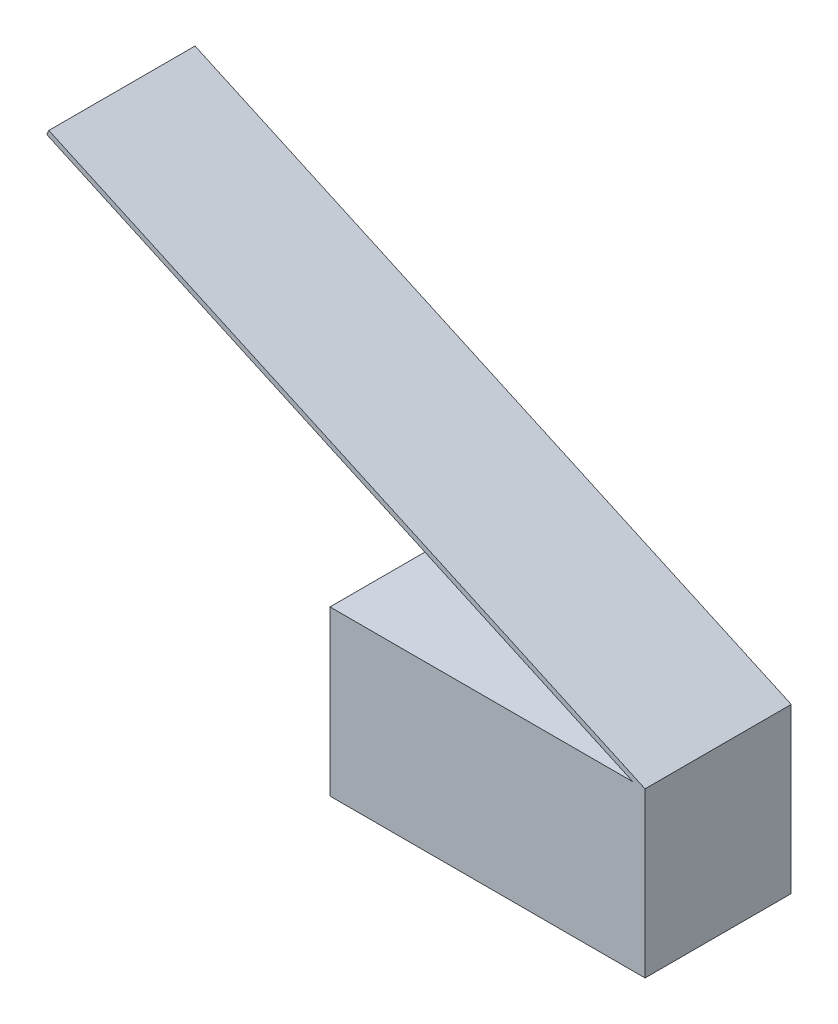
ISO-10303-21;
HEADER;
FILE_DESCRIPTION(('STEP AP214'),'2;1');
FILE_NAME('part.step','',(''),(''),'','','');
FILE_SCHEMA(('AUTOMOTIVE_DESIGN { 1 0 10303 214 1 1 1 1 }'));
ENDSEC;
DATA;
#1=APPLICATION_CONTEXT('core data for automotive mechanical design processes');
#2=APPLICATION_PROTOCOL_DEFINITION('international standard','automotive_design',2000,#1);
#3=PRODUCT_CONTEXT('',#1,'mechanical');
#4=PRODUCT('Part','Part','',(#3));
#5=PRODUCT_RELATED_PRODUCT_CATEGORY('part','',(#4));
#6=PRODUCT_DEFINITION_FORMATION('','',#4);
#7=PRODUCT_DEFINITION_CONTEXT('part definition',#1,'design');
#8=PRODUCT_DEFINITION('design','',#6,#7);
#9=PRODUCT_DEFINITION_SHAPE('','',#8);
#10=(LENGTH_UNIT() NAMED_UNIT(*) SI_UNIT(.MILLI.,.METRE.));
#11=(NAMED_UNIT(*) PLANE_ANGLE_UNIT() SI_UNIT($,.RADIAN.));
#12=(NAMED_UNIT(*) SI_UNIT($,.STERADIAN.) SOLID_ANGLE_UNIT());
#13=UNCERTAINTY_MEASURE_WITH_UNIT(LENGTH_MEASURE(1.E-05),#10,'distance_accuracy_value','');
#14=(GEOMETRIC_REPRESENTATION_CONTEXT(3) GLOBAL_UNCERTAINTY_ASSIGNED_CONTEXT((#13)) GLOBAL_UNIT_ASSIGNED_CONTEXT((#10,
#11,#12)) REPRESENTATION_CONTEXT('',''));
#15=CARTESIAN_POINT('',(0.,0.,0.));
#16=DIRECTION('',(0.,0.,1.));
#17=DIRECTION('',(1.,0.,0.));
#18=AXIS2_PLACEMENT_3D('',#15,#16,#17);
#19=CARTESIAN_POINT('',(-6.46718146718147,6.5,-2.82335907335907));
#20=DIRECTION('',(1.,0.,0.));
#21=DIRECTION('',(0.,0.,-1.));
#22=AXIS2_PLACEMENT_3D('',#19,#20,#21);
#23=PLANE('',#22);
#24=DIRECTION('',(0.,0.,1.));
#25=VECTOR('',#24,1.);
#26=CARTESIAN_POINT('',(-6.46718146718147,0.,-2.82335907335907));
#27=LINE('',#26,#25);
#28=CARTESIAN_POINT('',(-6.46718146718147,0.,-2.82335907335907));
#29=VERTEX_POINT('',#28);
#30=CARTESIAN_POINT('',(-6.46718146718147,0.,2.97664092664093));
#31=VERTEX_POINT('',#30);
#32=EDGE_CURVE('E131',#29,#31,#27,.T.);
#33=ORIENTED_EDGE('',*,*,#32,.T.);
#34=DIRECTION('',(0.,-1.,0.));
#35=VECTOR('',#34,1.);
#36=CARTESIAN_POINT('',(-6.46718146718147,6.5,2.97664092664093));
#37=LINE('',#36,#35);
#38=CARTESIAN_POINT('',(-6.46718146718147,6.5,2.97664092664093));
#39=VERTEX_POINT('',#38);
#40=EDGE_CURVE('E11',#39,#31,#37,.T.);
#41=ORIENTED_EDGE('',*,*,#40,.F.);
#42=DIRECTION('',(0.,0.,1.));
#43=VECTOR('',#42,1.);
#44=CARTESIAN_POINT('',(-6.46718146718147,6.5,-2.82335907335907));
#45=LINE('',#44,#43);
#46=CARTESIAN_POINT('',(-6.46718146718147,6.5,-2.82335907335907));
#47=VERTEX_POINT('',#46);
#48=EDGE_CURVE('E133',#47,#39,#45,.T.);
#49=ORIENTED_EDGE('',*,*,#48,.F.);
#50=DIRECTION('',(0.,-1.,0.));
#51=VECTOR('',#50,1.);
#52=CARTESIAN_POINT('',(-6.46718146718147,6.5,-2.82335907335907));
#53=LINE('',#52,#51);
#54=EDGE_CURVE('E138',#47,#29,#53,.T.);
#55=ORIENTED_EDGE('',*,*,#54,.T.);
#56=EDGE_LOOP('',(#33,#41,#49,#55));
#57=FACE_BOUND('',#56,.T.);
#58=ADVANCED_FACE('F34',(#57),#23,.F.);
#59=CARTESIAN_POINT('',(-6.46718146718147,6.5,2.97664092664093));
#60=DIRECTION('',(0.,0.,-1.));
#61=DIRECTION('',(-1.,0.,0.));
#62=AXIS2_PLACEMENT_3D('',#59,#60,#61);
#63=PLANE('',#62);
#64=DIRECTION('',(1.,0.,0.));
#65=VECTOR('',#64,1.);
#66=CARTESIAN_POINT('',(-6.46718146718147,0.,2.97664092664093));
#67=LINE('',#66,#65);
#68=CARTESIAN_POINT('',(6.03281853281853,0.,2.97664092664093));
#69=VERTEX_POINT('',#68);
#70=EDGE_CURVE('E141',#31,#69,#67,.T.);
#71=ORIENTED_EDGE('',*,*,#70,.T.);
#72=DIRECTION('',(0.,-1.,0.));
#73=VECTOR('',#72,1.);
#74=CARTESIAN_POINT('',(6.03281853281853,6.5,2.97664092664093));
#75=LINE('',#74,#73);
#76=CARTESIAN_POINT('',(6.03281853281853,6.5,2.97664092664093));
#77=VERTEX_POINT('',#76);
#78=EDGE_CURVE('E41',#77,#69,#75,.T.);
#79=ORIENTED_EDGE('',*,*,#78,.F.);
#80=DIRECTION('',(-0.909737388971566,0.415184155655293,0.));
#81=VECTOR('',#80,1.);
#82=CARTESIAN_POINT('',(6.03281853281853,6.5,2.97664092664093));
#83=LINE('',#82,#81);
#84=CARTESIAN_POINT('',(-17.6203535804422,17.2947880470376,2.97664092664093));
#85=VERTEX_POINT('',#84);
#86=EDGE_CURVE('E127',#77,#85,#83,.T.);
#87=ORIENTED_EDGE('',*,*,#86,.T.);
#88=DIRECTION('',(-0.415184155655291,-0.909737388971567,0.));
#89=VECTOR('',#88,1.);
#90=CARTESIAN_POINT('',(-17.6203535804422,17.2947880470376,2.97664092664093));
#91=LINE('',#90,#89);
#92=CARTESIAN_POINT('',(-17.7033904115732,17.1128405692433,2.97664092664093));
#93=VERTEX_POINT('',#92);
#94=EDGE_CURVE('E105',#85,#93,#91,.T.);
#95=ORIENTED_EDGE('',*,*,#94,.T.);
#96=DIRECTION('',(0.909737388971566,-0.415184155655293,0.));
#97=VECTOR('',#96,1.);
#98=CARTESIAN_POINT('',(-17.7033904115732,17.1128405692433,2.97664092664093));
#99=LINE('',#98,#97);
#100=CARTESIAN_POINT('',(5.55110458185061,6.5,2.97664092664093));
#101=VERTEX_POINT('',#100);
#102=EDGE_CURVE('E122',#93,#101,#99,.T.);
#103=ORIENTED_EDGE('',*,*,#102,.T.);
#104=DIRECTION('',(1.,0.,0.));
#105=VECTOR('',#104,1.);
#106=CARTESIAN_POINT('',(-6.46718146718147,6.5,2.97664092664093));
#107=LINE('',#106,#105);
#108=EDGE_CURVE('E81',#39,#101,#107,.T.);
#109=ORIENTED_EDGE('',*,*,#108,.F.);
#110=ORIENTED_EDGE('',*,*,#40,.T.);
#111=EDGE_LOOP('',(#71,#79,#87,#95,#103,#109,#110));
#112=FACE_BOUND('',#111,.T.);
#113=ADVANCED_FACE('F161',(#112),#63,.F.);
#114=CARTESIAN_POINT('',(6.03281853281853,6.5,-2.82335907335907));
#115=DIRECTION('',(-1.,0.,0.));
#116=DIRECTION('',(0.,0.,1.));
#117=AXIS2_PLACEMENT_3D('',#114,#115,#116);
#118=PLANE('',#117);
#119=DIRECTION('',(0.,0.,-1.));
#120=VECTOR('',#119,1.);
#121=CARTESIAN_POINT('',(6.03281853281853,0.,-2.82335907335907));
#122=LINE('',#121,#120);
#123=CARTESIAN_POINT('',(6.03281853281853,0.,-2.82335907335907));
#124=VERTEX_POINT('',#123);
#125=EDGE_CURVE('E143',#69,#124,#122,.T.);
#126=ORIENTED_EDGE('',*,*,#125,.T.);
#127=DIRECTION('',(0.,-1.,0.));
#128=VECTOR('',#127,1.);
#129=CARTESIAN_POINT('',(6.03281853281853,6.5,-2.82335907335907));
#130=LINE('',#129,#128);
#131=CARTESIAN_POINT('',(6.03281853281853,6.5,-2.82335907335907));
#132=VERTEX_POINT('',#131);
#133=EDGE_CURVE('E147',#132,#124,#130,.T.);
#134=ORIENTED_EDGE('',*,*,#133,.F.);
#135=DIRECTION('',(0.,0.,-1.));
#136=VECTOR('',#135,1.);
#137=CARTESIAN_POINT('',(6.03281853281853,6.5,-2.82335907335907));
#138=LINE('',#137,#136);
#139=EDGE_CURVE('E121',#77,#132,#138,.T.);
#140=ORIENTED_EDGE('',*,*,#139,.F.);
#141=ORIENTED_EDGE('',*,*,#78,.T.);
#142=EDGE_LOOP('',(#126,#134,#140,#141));
#143=FACE_BOUND('',#142,.T.);
#144=ADVANCED_FACE('F151',(#143),#118,.F.);
#145=CARTESIAN_POINT('',(-6.46718146718147,6.5,-2.82335907335907));
#146=DIRECTION('',(0.,0.,1.));
#147=DIRECTION('',(1.,0.,0.));
#148=AXIS2_PLACEMENT_3D('',#145,#146,#147);
#149=PLANE('',#148);
#150=DIRECTION('',(-1.,0.,0.));
#151=VECTOR('',#150,1.);
#152=CARTESIAN_POINT('',(-6.46718146718147,0.,-2.82335907335907));
#153=LINE('',#152,#151);
#154=EDGE_CURVE('E75',#124,#29,#153,.T.);
#155=ORIENTED_EDGE('',*,*,#154,.T.);
#156=ORIENTED_EDGE('',*,*,#54,.F.);
#157=DIRECTION('',(-1.,0.,0.));
#158=VECTOR('',#157,1.);
#159=CARTESIAN_POINT('',(-6.46718146718147,6.5,-2.82335907335907));
#160=LINE('',#159,#158);
#161=CARTESIAN_POINT('',(5.55110458185062,6.5,-2.82335907335907));
#162=VERTEX_POINT('',#161);
#163=EDGE_CURVE('E53',#162,#47,#160,.T.);
#164=ORIENTED_EDGE('',*,*,#163,.F.);
#165=DIRECTION('',(0.909737388971566,-0.415184155655293,0.));
#166=VECTOR('',#165,1.);
#167=CARTESIAN_POINT('',(-17.7033904115732,17.1128405692433,-2.82335907335907));
#168=LINE('',#167,#166);
#169=CARTESIAN_POINT('',(-17.7033904115732,17.1128405692433,-2.82335907335907));
#170=VERTEX_POINT('',#169);
#171=EDGE_CURVE('E111',#170,#162,#168,.T.);
#172=ORIENTED_EDGE('',*,*,#171,.F.);
#173=DIRECTION('',(-0.415184155655291,-0.909737388971567,0.));
#174=VECTOR('',#173,1.);
#175=CARTESIAN_POINT('',(-17.6203535804422,17.2947880470376,-2.82335907335907));
#176=LINE('',#175,#174);
#177=CARTESIAN_POINT('',(-17.6203535804422,17.2947880470376,-2.82335907335907));
#178=VERTEX_POINT('',#177);
#179=EDGE_CURVE('E102',#178,#170,#176,.T.);
#180=ORIENTED_EDGE('',*,*,#179,.F.);
#181=DIRECTION('',(-0.909737388971566,0.415184155655293,0.));
#182=VECTOR('',#181,1.);
#183=CARTESIAN_POINT('',(6.03281853281853,6.5,-2.82335907335907));
#184=LINE('',#183,#182);
#185=EDGE_CURVE('E115',#132,#178,#184,.T.);
#186=ORIENTED_EDGE('',*,*,#185,.F.);
#187=ORIENTED_EDGE('',*,*,#133,.T.);
#188=EDGE_LOOP('',(#155,#156,#164,#172,#180,#186,#187));
#189=FACE_BOUND('',#188,.T.);
#190=ADVANCED_FACE('F114',(#189),#149,.F.);
#191=CARTESIAN_POINT('',(0.,6.5,0.));
#192=DIRECTION('',(0.,1.,0.));
#193=DIRECTION('',(0.,0.,1.));
#194=AXIS2_PLACEMENT_3D('',#191,#192,#193);
#195=PLANE('',#194);
#196=DIRECTION('',(0.,0.,1.));
#197=VECTOR('',#196,1.);
#198=CARTESIAN_POINT('',(5.55110458185061,6.5,-2.82335907335907));
#199=LINE('',#198,#197);
#200=EDGE_CURVE('E48',#162,#101,#199,.T.);
#201=ORIENTED_EDGE('',*,*,#200,.F.);
#202=ORIENTED_EDGE('',*,*,#163,.T.);
#203=ORIENTED_EDGE('',*,*,#48,.T.);
#204=ORIENTED_EDGE('',*,*,#108,.T.);
#205=EDGE_LOOP('',(#201,#202,#203,#204));
#206=FACE_BOUND('',#205,.T.);
#207=ADVANCED_FACE('F171',(#206),#195,.T.);
#208=CARTESIAN_POINT('',(0.,0.,0.));
#209=DIRECTION('',(0.,1.,0.));
#210=DIRECTION('',(0.,0.,1.));
#211=AXIS2_PLACEMENT_3D('',#208,#209,#210);
#212=PLANE('',#211);
#213=ORIENTED_EDGE('',*,*,#32,.F.);
#214=ORIENTED_EDGE('',*,*,#154,.F.);
#215=ORIENTED_EDGE('',*,*,#125,.F.);
#216=ORIENTED_EDGE('',*,*,#70,.F.);
#217=EDGE_LOOP('',(#213,#214,#215,#216));
#218=FACE_BOUND('',#217,.T.);
#219=ADVANCED_FACE('F154',(#218),#212,.F.);
#220=CARTESIAN_POINT('',(-17.7033904115732,17.1128405692433,-2.82335907335907));
#221=DIRECTION('',(-0.415184155655293,-0.909737388971566,0.));
#222=DIRECTION('',(0.909737388971566,-0.415184155655293,0.));
#223=AXIS2_PLACEMENT_3D('',#220,#221,#222);
#224=PLANE('',#223);
#225=ORIENTED_EDGE('',*,*,#102,.F.);
#226=DIRECTION('',(0.,0.,1.));
#227=VECTOR('',#226,1.);
#228=CARTESIAN_POINT('',(-17.7033904115732,17.1128405692433,-2.82335907335907));
#229=LINE('',#228,#227);
#230=EDGE_CURVE('E110',#170,#93,#229,.T.);
#231=ORIENTED_EDGE('',*,*,#230,.F.);
#232=ORIENTED_EDGE('',*,*,#171,.T.);
#233=ORIENTED_EDGE('',*,*,#200,.T.);
#234=EDGE_LOOP('',(#225,#231,#232,#233));
#235=FACE_BOUND('',#234,.T.);
#236=ADVANCED_FACE('F160',(#235),#224,.T.);
#237=CARTESIAN_POINT('',(-17.6203535804422,17.2947880470376,-2.82335907335907));
#238=DIRECTION('',(-0.909737388971566,0.415184155655291,0.));
#239=DIRECTION('',(-0.415184155655291,-0.909737388971566,0.));
#240=AXIS2_PLACEMENT_3D('',#237,#238,#239);
#241=PLANE('',#240);
#242=ORIENTED_EDGE('',*,*,#94,.F.);
#243=DIRECTION('',(0.,0.,1.));
#244=VECTOR('',#243,1.);
#245=CARTESIAN_POINT('',(-17.6203535804422,17.2947880470376,-2.82335907335907));
#246=LINE('',#245,#244);
#247=EDGE_CURVE('E99',#178,#85,#246,.T.);
#248=ORIENTED_EDGE('',*,*,#247,.F.);
#249=ORIENTED_EDGE('',*,*,#179,.T.);
#250=ORIENTED_EDGE('',*,*,#230,.T.);
#251=EDGE_LOOP('',(#242,#248,#249,#250));
#252=FACE_BOUND('',#251,.T.);
#253=ADVANCED_FACE('F101',(#252),#241,.T.);
#254=CARTESIAN_POINT('',(6.03281853281853,6.5,-2.82335907335907));
#255=DIRECTION('',(0.415184155655293,0.909737388971566,0.));
#256=DIRECTION('',(-0.909737388971566,0.415184155655293,0.));
#257=AXIS2_PLACEMENT_3D('',#254,#255,#256);
#258=PLANE('',#257);
#259=ORIENTED_EDGE('',*,*,#86,.F.);
#260=ORIENTED_EDGE('',*,*,#139,.T.);
#261=ORIENTED_EDGE('',*,*,#185,.T.);
#262=ORIENTED_EDGE('',*,*,#247,.T.);
#263=EDGE_LOOP('',(#259,#260,#261,#262));
#264=FACE_BOUND('',#263,.T.);
#265=ADVANCED_FACE('F119',(#264),#258,.T.);
#266=CLOSED_SHELL('',(#58,#113,#144,#190,#207,#219,#236,#253,#265));
#267=MANIFOLD_SOLID_BREP('B2',#266);
#268=ADVANCED_BREP_SHAPE_REPRESENTATION('',(#18,#267),#14);
#269=SHAPE_DEFINITION_REPRESENTATION(#9,#268);
ENDSEC;
END-ISO-10303-21;
